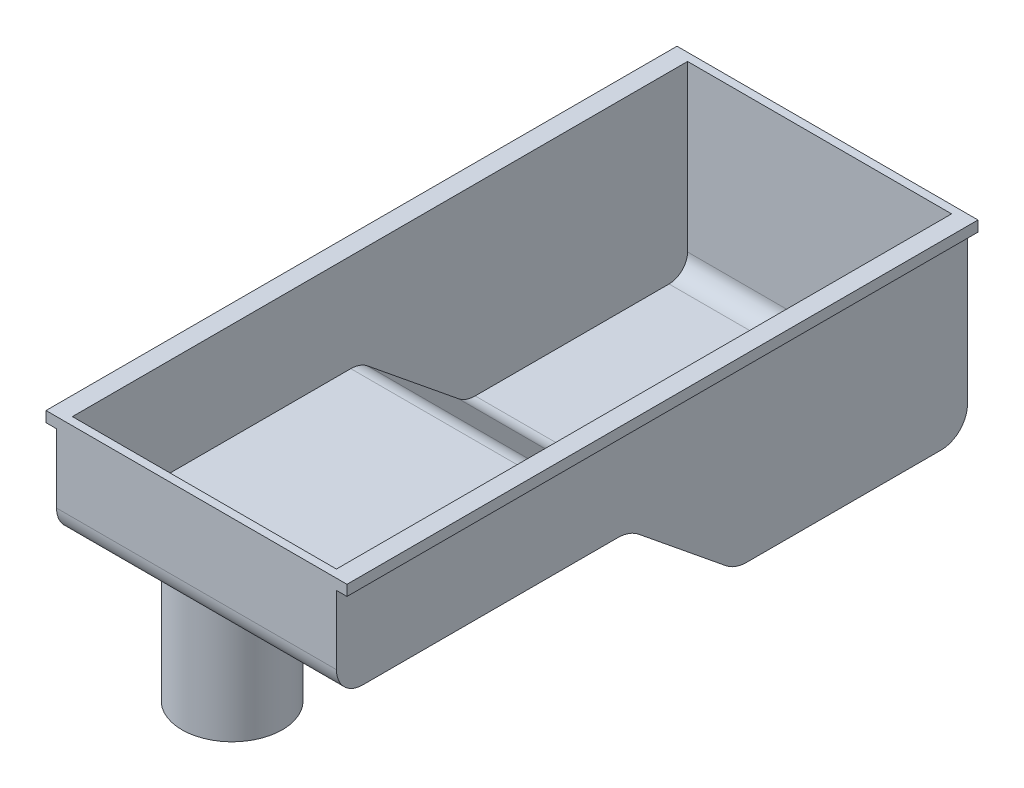
ISO-10303-21;
HEADER;
FILE_DESCRIPTION(('STEP AP214'),'2;1');
FILE_NAME('part.step','',(''),(''),'','','');
FILE_SCHEMA(('AUTOMOTIVE_DESIGN { 1 0 10303 214 1 1 1 1 }'));
ENDSEC;
DATA;
#1=APPLICATION_CONTEXT('core data for automotive mechanical design processes');
#2=APPLICATION_PROTOCOL_DEFINITION('international standard','automotive_design',2000,#1);
#3=PRODUCT_CONTEXT('',#1,'mechanical');
#4=PRODUCT('Part','Part','',(#3));
#5=PRODUCT_RELATED_PRODUCT_CATEGORY('part','',(#4));
#6=PRODUCT_DEFINITION_FORMATION('','',#4);
#7=PRODUCT_DEFINITION_CONTEXT('part definition',#1,'design');
#8=PRODUCT_DEFINITION('design','',#6,#7);
#9=PRODUCT_DEFINITION_SHAPE('','',#8);
#10=(LENGTH_UNIT() NAMED_UNIT(*) SI_UNIT(.MILLI.,.METRE.));
#11=(NAMED_UNIT(*) PLANE_ANGLE_UNIT() SI_UNIT($,.RADIAN.));
#12=(NAMED_UNIT(*) SI_UNIT($,.STERADIAN.) SOLID_ANGLE_UNIT());
#13=UNCERTAINTY_MEASURE_WITH_UNIT(LENGTH_MEASURE(1.E-05),#10,'distance_accuracy_value','');
#14=(GEOMETRIC_REPRESENTATION_CONTEXT(3) GLOBAL_UNCERTAINTY_ASSIGNED_CONTEXT((#13)) GLOBAL_UNIT_ASSIGNED_CONTEXT((#10,
#11,#12)) REPRESENTATION_CONTEXT('',''));
#15=CARTESIAN_POINT('',(0.,0.,0.));
#16=DIRECTION('',(0.,0.,1.));
#17=DIRECTION('',(1.,0.,0.));
#18=AXIS2_PLACEMENT_3D('',#15,#16,#17);
#19=CARTESIAN_POINT('',(106.,-195.,-386.));
#20=DIRECTION('',(-1.,0.,0.));
#21=DIRECTION('',(0.,0.,1.));
#22=AXIS2_PLACEMENT_3D('',#19,#20,#21);
#23=CYLINDRICAL_SURFACE('',#22,20.);
#24=CARTESIAN_POINT('',(-9.21954445729288,-215.,-386.));
#25=CARTESIAN_POINT('',(-9.05278508268081,-215.000020802602,-386.256313627976));
#26=CARTESIAN_POINT('',(-8.87530801415313,-214.995073200367,-386.505577913972));
#27=CARTESIAN_POINT('',(-8.50047353801595,-214.977024675888,-386.988206420821));
#28=CARTESIAN_POINT('',(-8.30312472437645,-214.96392726562,-387.221577442487));
#29=CARTESIAN_POINT('',(-7.89028092512723,-214.931385206945,-387.670488010725));
#30=CARTESIAN_POINT('',(-7.67481500139358,-214.911950585242,-387.886055055774));
#31=CARTESIAN_POINT('',(-7.22698577482958,-214.868577327427,-388.298392220045));
#32=CARTESIAN_POINT('',(-6.99462089651734,-214.844638271038,-388.495160582708));
#33=CARTESIAN_POINT('',(-6.51481956521724,-214.794126433541,-388.86845132525));
#34=CARTESIAN_POINT('',(-6.26739865290406,-214.767556350955,-389.044994056733));
#35=CARTESIAN_POINT('',(-5.75886897813163,-214.713557277438,-389.376973451292));
#36=CARTESIAN_POINT('',(-5.49776010593598,-214.686128279623,-389.532409945124));
#37=CARTESIAN_POINT('',(-4.96346834142791,-214.632114786935,-389.821212438654));
#38=CARTESIAN_POINT('',(-4.69028350966651,-214.605530428902,-389.95457487673));
#39=CARTESIAN_POINT('',(-4.13361887388644,-214.554787204402,-390.198309450967));
#40=CARTESIAN_POINT('',(-3.85013894391908,-214.530628367623,-390.308681305753));
#41=CARTESIAN_POINT('',(-3.26868294734252,-214.485664841521,-390.507716447418));
#42=CARTESIAN_POINT('',(-2.97052742981667,-214.464941322273,-390.595874704431));
#43=CARTESIAN_POINT('',(-2.36751580569059,-214.428713503509,-390.746695300511));
#44=CARTESIAN_POINT('',(-2.06265961676751,-214.413209268152,-390.809357326152));
#45=CARTESIAN_POINT('',(-1.44853920842501,-214.388343464008,-390.908641725651));
#46=CARTESIAN_POINT('',(-1.13927578682853,-214.378980797513,-390.945268752939));
#47=CARTESIAN_POINT('',(-0.518631179818974,-214.366951301381,-390.992172859298));
#48=CARTESIAN_POINT('',(-0.207250056176293,-214.364284277273,-391.002450703659));
#49=CARTESIAN_POINT('',(0.406436690420613,-214.365781554164,-390.996649317356));
#50=CARTESIAN_POINT('',(0.708750027151972,-214.369754867383,-390.981306978291));
#51=CARTESIAN_POINT('',(1.31093408221065,-214.383947399366,-390.925789499756));
#52=CARTESIAN_POINT('',(1.61080484028791,-214.39416651628,-390.885614765223));
#53=CARTESIAN_POINT('',(2.2060007428849,-214.420278086379,-390.780764607936));
#54=CARTESIAN_POINT('',(2.50132550327063,-214.436171016282,-390.716087126413));
#55=CARTESIAN_POINT('',(3.08537500161032,-214.472738492174,-390.562746898713));
#56=CARTESIAN_POINT('',(3.37409966690518,-214.493413090776,-390.474083888622));
#57=CARTESIAN_POINT('',(3.94286674122053,-214.538367230415,-390.273494346161));
#58=CARTESIAN_POINT('',(4.22291406938259,-214.56264468208,-390.161581282047));
#59=CARTESIAN_POINT('',(4.7728346398202,-214.613443205544,-389.915184024692));
#60=CARTESIAN_POINT('',(5.04270319943638,-214.6399652922,-389.780689594508));
#61=CARTESIAN_POINT('',(5.57041299576905,-214.693687092041,-389.490059343399));
#62=CARTESIAN_POINT('',(5.82825553208354,-214.720886731517,-389.333925868184));
#63=CARTESIAN_POINT('',(6.3302219092154,-214.774278174678,-389.001052351816));
#64=CARTESIAN_POINT('',(6.57435188964691,-214.800470427724,-388.824321643565));
#65=CARTESIAN_POINT('',(7.0450681277452,-214.849853410485,-388.453161037628));
#66=CARTESIAN_POINT('',(7.27180688867342,-214.873071825938,-388.258928293407));
#67=CARTESIAN_POINT('',(7.70894821996101,-214.915072760865,-387.852464457483));
#68=CARTESIAN_POINT('',(7.9193523867452,-214.933855714197,-387.640235128889));
#69=CARTESIAN_POINT('',(8.3226874588647,-214.965267542744,-387.198772305427));
#70=CARTESIAN_POINT('',(8.51559312998613,-214.977887642007,-386.969515094467));
#71=CARTESIAN_POINT('',(8.88228574193664,-214.995265221027,-386.495766594298));
#72=CARTESIAN_POINT('',(9.05606467296773,-215.000019418348,-386.251268989423));
#73=CARTESIAN_POINT('',(9.2195444572929,-215.,-386.));
#74=B_SPLINE_CURVE_WITH_KNOTS('',3,(#24,#25,#26,#27,#28,#29,#30,#31,#32,#33,#34,#35,#36,#37,#38,
#39,#40,#41,#42,#43,#44,#45,#46,#47,#48,#49,#50,#51,#52,#53,#54,#55,#56,#57,#58,#59,#60,#61,#62,
#63,#64,#65,#66,#67,#68,#69,#70,#71,#72,#73),.UNSPECIFIED.,.F.,.F.,(4,2,2,2,2,2,2,2,2,2,2,2,2,2,
2,2,2,2,2,2,2,2,2,2,4),(0.,0.916961714728091,1.83352855878945,2.74865219555347,3.66386125852173,
4.57814117006574,5.49242841251498,6.40686303059156,7.32130883949561,8.25497453013639,
9.18865169798879,10.1221619406943,11.0556450700144,11.9627389547508,12.8698180480442,
13.7769733728011,14.6841386794406,15.590779942727,16.497833334271,17.4047884764588,
18.311334250469,19.2087084273529,20.1059947906924,21.0045551975687,21.9034904785961),.UNSPECIFIED.);
#75=CARTESIAN_POINT('',(-9.21954445729288,-215.,-386.));
#76=VERTEX_POINT('',#75);
#77=CARTESIAN_POINT('',(9.21954445729288,-215.,-386.));
#78=VERTEX_POINT('',#77);
#79=EDGE_CURVE('E52',#76,#78,#74,.T.);
#80=ORIENTED_EDGE('',*,*,#79,.F.);
#81=DIRECTION('',(-1.,0.,0.));
#82=VECTOR('',#81,1.);
#83=CARTESIAN_POINT('',(106.,-215.,-386.));
#84=LINE('',#83,#82);
#85=CARTESIAN_POINT('',(-106.,-215.,-386.));
#86=VERTEX_POINT('',#85);
#87=EDGE_CURVE('E216',#76,#86,#84,.T.);
#88=ORIENTED_EDGE('',*,*,#87,.T.);
#89=CARTESIAN_POINT('',(-106.,-195.,-386.));
#90=DIRECTION('',(1.,0.,0.));
#91=DIRECTION('',(0.,0.,1.));
#92=AXIS2_PLACEMENT_3D('',#89,#90,#91);
#93=CIRCLE('',#92,20.);
#94=CARTESIAN_POINT('',(-106.,-195.,-406.));
#95=VERTEX_POINT('',#94);
#96=EDGE_CURVE('E551',#86,#95,#93,.T.);
#97=ORIENTED_EDGE('',*,*,#96,.T.);
#98=DIRECTION('',(-1.,0.,0.));
#99=VECTOR('',#98,1.);
#100=CARTESIAN_POINT('',(106.,-195.,-406.));
#101=LINE('',#100,#99);
#102=CARTESIAN_POINT('',(106.,-195.,-406.));
#103=VERTEX_POINT('',#102);
#104=EDGE_CURVE('E559',#103,#95,#101,.T.);
#105=ORIENTED_EDGE('',*,*,#104,.F.);
#106=CARTESIAN_POINT('',(106.,-195.,-386.));
#107=DIRECTION('',(1.,0.,0.));
#108=DIRECTION('',(0.,0.,1.));
#109=AXIS2_PLACEMENT_3D('',#106,#107,#108);
#110=CIRCLE('',#109,20.);
#111=CARTESIAN_POINT('',(106.,-215.,-386.));
#112=VERTEX_POINT('',#111);
#113=EDGE_CURVE('E215',#112,#103,#110,.T.);
#114=ORIENTED_EDGE('',*,*,#113,.F.);
#115=EDGE_CURVE('E208',#112,#78,#84,.T.);
#116=ORIENTED_EDGE('',*,*,#115,.T.);
#117=EDGE_LOOP('',(#80,#88,#97,#105,#114,#116));
#118=FACE_BOUND('',#117,.T.);
#119=ADVANCED_FACE('F44',(#118),#23,.T.);
#120=CARTESIAN_POINT('',(106.,-70.,72.));
#121=DIRECTION('',(0.,-1.,0.));
#122=DIRECTION('',(0.,0.,-1.));
#123=AXIS2_PLACEMENT_3D('',#120,#121,#122);
#124=PLANE('',#123);
#125=DIRECTION('',(-1.,0.,0.));
#126=VECTOR('',#125,1.);
#127=CARTESIAN_POINT('',(106.,-70.,-406.));
#128=LINE('',#127,#126);
#129=CARTESIAN_POINT('',(114.,-70.,-406.));
#130=VERTEX_POINT('',#129);
#131=CARTESIAN_POINT('',(-114.,-70.,-406.));
#132=VERTEX_POINT('',#131);
#133=EDGE_CURVE('E560',#130,#132,#128,.T.);
#134=ORIENTED_EDGE('',*,*,#133,.T.);
#135=DIRECTION('',(0.,0.,-1.));
#136=VECTOR('',#135,1.);
#137=CARTESIAN_POINT('',(-114.,-70.,72.));
#138=LINE('',#137,#136);
#139=CARTESIAN_POINT('',(-114.,-70.,72.));
#140=VERTEX_POINT('',#139);
#141=EDGE_CURVE('E498',#140,#132,#138,.T.);
#142=ORIENTED_EDGE('',*,*,#141,.F.);
#143=DIRECTION('',(-1.,0.,0.));
#144=VECTOR('',#143,1.);
#145=CARTESIAN_POINT('',(106.,-70.,72.));
#146=LINE('',#145,#144);
#147=CARTESIAN_POINT('',(114.,-70.,72.));
#148=VERTEX_POINT('',#147);
#149=EDGE_CURVE('E536',#148,#140,#146,.T.);
#150=ORIENTED_EDGE('',*,*,#149,.F.);
#151=DIRECTION('',(0.,0.,-1.));
#152=VECTOR('',#151,1.);
#153=CARTESIAN_POINT('',(114.,-70.,72.));
#154=LINE('',#153,#152);
#155=EDGE_CURVE('E507',#148,#130,#154,.T.);
#156=ORIENTED_EDGE('',*,*,#155,.T.);
#157=EDGE_LOOP('',(#134,#142,#150,#156));
#158=FACE_BOUND('',#157,.T.);
#159=DIRECTION('',(0.,0.,-1.));
#160=VECTOR('',#159,1.);
#161=CARTESIAN_POINT('',(100.,-70.,72.));
#162=LINE('',#161,#160);
#163=CARTESIAN_POINT('',(100.,-70.,66.));
#164=VERTEX_POINT('',#163);
#165=CARTESIAN_POINT('',(100.,-70.,-400.));
#166=VERTEX_POINT('',#165);
#167=EDGE_CURVE('E226',#164,#166,#162,.T.);
#168=ORIENTED_EDGE('',*,*,#167,.F.);
#169=DIRECTION('',(1.,0.,0.));
#170=VECTOR('',#169,1.);
#171=CARTESIAN_POINT('',(106.,-70.,66.));
#172=LINE('',#171,#170);
#173=CARTESIAN_POINT('',(-100.,-70.,66.));
#174=VERTEX_POINT('',#173);
#175=EDGE_CURVE('E230',#174,#164,#172,.T.);
#176=ORIENTED_EDGE('',*,*,#175,.F.);
#177=DIRECTION('',(0.,0.,-1.));
#178=VECTOR('',#177,1.);
#179=CARTESIAN_POINT('',(-100.,-70.,72.));
#180=LINE('',#179,#178);
#181=CARTESIAN_POINT('',(-100.,-70.,-400.));
#182=VERTEX_POINT('',#181);
#183=EDGE_CURVE('E584',#174,#182,#180,.T.);
#184=ORIENTED_EDGE('',*,*,#183,.T.);
#185=DIRECTION('',(-1.,0.,0.));
#186=VECTOR('',#185,1.);
#187=CARTESIAN_POINT('',(106.,-70.,-400.));
#188=LINE('',#187,#186);
#189=EDGE_CURVE('E583',#166,#182,#188,.T.);
#190=ORIENTED_EDGE('',*,*,#189,.F.);
#191=EDGE_LOOP('',(#168,#176,#184,#190));
#192=FACE_BOUND('',#191,.T.);
#193=ADVANCED_FACE('F307',(#158,#192),#124,.F.);
#194=CARTESIAN_POINT('',(106.,-195.,-386.));
#195=DIRECTION('',(-1.,0.,0.));
#196=DIRECTION('',(0.,0.,1.));
#197=AXIS2_PLACEMENT_3D('',#194,#195,#196);
#198=PLANE('',#197);
#199=DIRECTION('',(0.,0.,-1.));
#200=VECTOR('',#199,1.);
#201=CARTESIAN_POINT('',(106.,-78.,-386.));
#202=LINE('',#201,#200);
#203=CARTESIAN_POINT('',(106.,-78.,72.));
#204=VERTEX_POINT('',#203);
#205=CARTESIAN_POINT('',(106.,-78.,-406.));
#206=VERTEX_POINT('',#205);
#207=EDGE_CURVE('E519',#204,#206,#202,.T.);
#208=ORIENTED_EDGE('',*,*,#207,.F.);
#209=DIRECTION('',(0.,-1.,0.));
#210=VECTOR('',#209,1.);
#211=CARTESIAN_POINT('',(106.,-130.,72.));
#212=LINE('',#211,#210);
#213=CARTESIAN_POINT('',(106.,-130.,72.));
#214=VERTEX_POINT('',#213);
#215=EDGE_CURVE('E524',#204,#214,#212,.T.);
#216=ORIENTED_EDGE('',*,*,#215,.T.);
#217=CARTESIAN_POINT('',(106.,-130.,52.));
#218=DIRECTION('',(1.,0.,0.));
#219=DIRECTION('',(0.,0.,1.));
#220=AXIS2_PLACEMENT_3D('',#217,#218,#219);
#221=CIRCLE('',#220,20.);
#222=CARTESIAN_POINT('',(106.,-150.,52.));
#223=VERTEX_POINT('',#222);
#224=EDGE_CURVE('E525',#214,#223,#221,.T.);
#225=ORIENTED_EDGE('',*,*,#224,.T.);
#226=DIRECTION('',(0.,0.,-1.));
#227=VECTOR('',#226,1.);
#228=CARTESIAN_POINT('',(106.,-150.,-141.123984369061));
#229=LINE('',#228,#227);
#230=CARTESIAN_POINT('',(106.,-150.,-141.123984369061));
#231=VERTEX_POINT('',#230);
#232=EDGE_CURVE('E526',#223,#231,#229,.T.);
#233=ORIENTED_EDGE('',*,*,#232,.T.);
#234=CARTESIAN_POINT('',(106.,-175.,-141.123984369061));
#235=DIRECTION('',(-1.,0.,0.));
#236=DIRECTION('',(0.,0.,-1.));
#237=AXIS2_PLACEMENT_3D('',#234,#235,#236);
#238=CIRCLE('',#237,25.);
#239=CARTESIAN_POINT('',(106.,-155.597149997093,-156.888799996423));
#240=VERTEX_POINT('',#239);
#241=EDGE_CURVE('E528',#231,#240,#238,.T.);
#242=ORIENTED_EDGE('',*,*,#241,.T.);
#243=DIRECTION('',(0.,-0.630592625094466,-0.776114000116266));
#244=VECTOR('',#243,1.);
#245=CARTESIAN_POINT('',(106.,-209.402850002907,-223.111200003577));
#246=LINE('',#245,#244);
#247=CARTESIAN_POINT('',(106.,-209.402850002907,-223.111200003577));
#248=VERTEX_POINT('',#247);
#249=EDGE_CURVE('E529',#240,#248,#246,.T.);
#250=ORIENTED_EDGE('',*,*,#249,.T.);
#251=CARTESIAN_POINT('',(106.,-190.,-238.876015630939));
#252=DIRECTION('',(1.,0.,0.));
#253=DIRECTION('',(0.,0.,1.));
#254=AXIS2_PLACEMENT_3D('',#251,#252,#253);
#255=CIRCLE('',#254,25.);
#256=CARTESIAN_POINT('',(106.,-215.,-238.876015630939));
#257=VERTEX_POINT('',#256);
#258=EDGE_CURVE('E535',#248,#257,#255,.T.);
#259=ORIENTED_EDGE('',*,*,#258,.T.);
#260=DIRECTION('',(0.,0.,-1.));
#261=VECTOR('',#260,1.);
#262=CARTESIAN_POINT('',(106.,-215.,-386.));
#263=LINE('',#262,#261);
#264=EDGE_CURVE('E534',#257,#112,#263,.T.);
#265=ORIENTED_EDGE('',*,*,#264,.T.);
#266=ORIENTED_EDGE('',*,*,#113,.T.);
#267=DIRECTION('',(0.,1.,0.));
#268=VECTOR('',#267,1.);
#269=CARTESIAN_POINT('',(106.,-70.,-406.));
#270=LINE('',#269,#268);
#271=EDGE_CURVE('E539',#103,#206,#270,.T.);
#272=ORIENTED_EDGE('',*,*,#271,.T.);
#273=EDGE_LOOP('',(#208,#216,#225,#233,#242,#250,#259,#265,#266,#272));
#274=FACE_BOUND('',#273,.T.);
#275=ADVANCED_FACE('F304',(#274),#198,.F.);
#276=CARTESIAN_POINT('',(-106.,-195.,-386.));
#277=DIRECTION('',(-1.,0.,0.));
#278=DIRECTION('',(0.,0.,1.));
#279=AXIS2_PLACEMENT_3D('',#276,#277,#278);
#280=PLANE('',#279);
#281=DIRECTION('',(0.,-1.,0.));
#282=VECTOR('',#281,1.);
#283=CARTESIAN_POINT('',(-106.,-130.,72.));
#284=LINE('',#283,#282);
#285=CARTESIAN_POINT('',(-106.,-78.,72.));
#286=VERTEX_POINT('',#285);
#287=CARTESIAN_POINT('',(-106.,-130.,72.));
#288=VERTEX_POINT('',#287);
#289=EDGE_CURVE('E518',#286,#288,#284,.T.);
#290=ORIENTED_EDGE('',*,*,#289,.F.);
#291=DIRECTION('',(0.,0.,-1.));
#292=VECTOR('',#291,1.);
#293=CARTESIAN_POINT('',(-106.,-78.,-386.));
#294=LINE('',#293,#292);
#295=CARTESIAN_POINT('',(-106.,-78.,-406.));
#296=VERTEX_POINT('',#295);
#297=EDGE_CURVE('E576',#286,#296,#294,.T.);
#298=ORIENTED_EDGE('',*,*,#297,.T.);
#299=DIRECTION('',(0.,1.,0.));
#300=VECTOR('',#299,1.);
#301=CARTESIAN_POINT('',(-106.,-70.,-406.));
#302=LINE('',#301,#300);
#303=EDGE_CURVE('E523',#95,#296,#302,.T.);
#304=ORIENTED_EDGE('',*,*,#303,.F.);
#305=ORIENTED_EDGE('',*,*,#96,.F.);
#306=DIRECTION('',(0.,0.,-1.));
#307=VECTOR('',#306,1.);
#308=CARTESIAN_POINT('',(-106.,-215.,-386.));
#309=LINE('',#308,#307);
#310=CARTESIAN_POINT('',(-106.,-215.,-238.876015630939));
#311=VERTEX_POINT('',#310);
#312=EDGE_CURVE('E553',#311,#86,#309,.T.);
#313=ORIENTED_EDGE('',*,*,#312,.F.);
#314=CARTESIAN_POINT('',(-106.,-190.,-238.876015630939));
#315=DIRECTION('',(1.,0.,0.));
#316=DIRECTION('',(0.,0.,1.));
#317=AXIS2_PLACEMENT_3D('',#314,#315,#316);
#318=CIRCLE('',#317,25.);
#319=CARTESIAN_POINT('',(-106.,-209.402850002907,-223.111200003577));
#320=VERTEX_POINT('',#319);
#321=EDGE_CURVE('E547',#320,#311,#318,.T.);
#322=ORIENTED_EDGE('',*,*,#321,.F.);
#323=DIRECTION('',(0.,-0.630592625094466,-0.776114000116266));
#324=VECTOR('',#323,1.);
#325=CARTESIAN_POINT('',(-106.,-209.402850002907,-223.111200003577));
#326=LINE('',#325,#324);
#327=CARTESIAN_POINT('',(-106.,-155.597149997093,-156.888799996423));
#328=VERTEX_POINT('',#327);
#329=EDGE_CURVE('E550',#328,#320,#326,.T.);
#330=ORIENTED_EDGE('',*,*,#329,.F.);
#331=CARTESIAN_POINT('',(-106.,-175.,-141.123984369061));
#332=DIRECTION('',(-1.,0.,0.));
#333=DIRECTION('',(0.,0.,-1.));
#334=AXIS2_PLACEMENT_3D('',#331,#332,#333);
#335=CIRCLE('',#334,25.);
#336=CARTESIAN_POINT('',(-106.,-150.,-141.123984369061));
#337=VERTEX_POINT('',#336);
#338=EDGE_CURVE('E542',#337,#328,#335,.T.);
#339=ORIENTED_EDGE('',*,*,#338,.F.);
#340=DIRECTION('',(0.,0.,-1.));
#341=VECTOR('',#340,1.);
#342=CARTESIAN_POINT('',(-106.,-150.,-141.123984369061));
#343=LINE('',#342,#341);
#344=CARTESIAN_POINT('',(-106.,-150.,52.));
#345=VERTEX_POINT('',#344);
#346=EDGE_CURVE('E545',#345,#337,#343,.T.);
#347=ORIENTED_EDGE('',*,*,#346,.F.);
#348=CARTESIAN_POINT('',(-106.,-130.,52.));
#349=DIRECTION('',(1.,0.,0.));
#350=DIRECTION('',(0.,0.,1.));
#351=AXIS2_PLACEMENT_3D('',#348,#349,#350);
#352=CIRCLE('',#351,20.);
#353=EDGE_CURVE('E544',#288,#345,#352,.T.);
#354=ORIENTED_EDGE('',*,*,#353,.F.);
#355=EDGE_LOOP('',(#290,#298,#304,#305,#313,#322,#330,#339,#347,#354));
#356=FACE_BOUND('',#355,.T.);
#357=ADVANCED_FACE('F308',(#356),#280,.T.);
#358=CARTESIAN_POINT('',(106.,-130.,72.));
#359=DIRECTION('',(0.,0.,-1.));
#360=DIRECTION('',(-1.,0.,0.));
#361=AXIS2_PLACEMENT_3D('',#358,#359,#360);
#362=PLANE('',#361);
#363=ORIENTED_EDGE('',*,*,#149,.T.);
#364=DIRECTION('',(0.,-1.,0.));
#365=VECTOR('',#364,1.);
#366=CARTESIAN_POINT('',(-114.,-70.,72.));
#367=LINE('',#366,#365);
#368=CARTESIAN_POINT('',(-114.,-78.,72.));
#369=VERTEX_POINT('',#368);
#370=EDGE_CURVE('E487',#140,#369,#367,.T.);
#371=ORIENTED_EDGE('',*,*,#370,.T.);
#372=DIRECTION('',(1.,0.,0.));
#373=VECTOR('',#372,1.);
#374=CARTESIAN_POINT('',(-114.,-78.,72.));
#375=LINE('',#374,#373);
#376=EDGE_CURVE('E495',#369,#286,#375,.T.);
#377=ORIENTED_EDGE('',*,*,#376,.T.);
#378=ORIENTED_EDGE('',*,*,#289,.T.);
#379=DIRECTION('',(-1.,0.,0.));
#380=VECTOR('',#379,1.);
#381=CARTESIAN_POINT('',(106.,-130.,72.));
#382=LINE('',#381,#380);
#383=EDGE_CURVE('E577',#214,#288,#382,.T.);
#384=ORIENTED_EDGE('',*,*,#383,.F.);
#385=ORIENTED_EDGE('',*,*,#215,.F.);
#386=CARTESIAN_POINT('',(114.,-78.,72.));
#387=VERTEX_POINT('',#386);
#388=EDGE_CURVE('E489',#204,#387,#375,.T.);
#389=ORIENTED_EDGE('',*,*,#388,.T.);
#390=DIRECTION('',(0.,1.,0.));
#391=VECTOR('',#390,1.);
#392=CARTESIAN_POINT('',(114.,-78.,72.));
#393=LINE('',#392,#391);
#394=EDGE_CURVE('E492',#387,#148,#393,.T.);
#395=ORIENTED_EDGE('',*,*,#394,.T.);
#396=EDGE_LOOP('',(#363,#371,#377,#378,#384,#385,#389,#395));
#397=FACE_BOUND('',#396,.T.);
#398=ADVANCED_FACE('F50',(#397),#362,.F.);
#399=CARTESIAN_POINT('',(106.,-130.,52.));
#400=DIRECTION('',(-1.,0.,0.));
#401=DIRECTION('',(0.,0.,1.));
#402=AXIS2_PLACEMENT_3D('',#399,#400,#401);
#403=CYLINDRICAL_SURFACE('',#402,20.);
#404=ORIENTED_EDGE('',*,*,#353,.T.);
#405=DIRECTION('',(-1.,0.,0.));
#406=VECTOR('',#405,1.);
#407=CARTESIAN_POINT('',(106.,-150.,52.));
#408=LINE('',#407,#406);
#409=EDGE_CURVE('E572',#223,#345,#408,.T.);
#410=ORIENTED_EDGE('',*,*,#409,.F.);
#411=ORIENTED_EDGE('',*,*,#224,.F.);
#412=ORIENTED_EDGE('',*,*,#383,.T.);
#413=EDGE_LOOP('',(#404,#410,#411,#412));
#414=FACE_BOUND('',#413,.T.);
#415=ADVANCED_FACE('F360',(#414),#403,.T.);
#416=CARTESIAN_POINT('',(106.,-150.,-141.123984369061));
#417=DIRECTION('',(0.,1.,0.));
#418=DIRECTION('',(0.,0.,1.));
#419=AXIS2_PLACEMENT_3D('',#416,#417,#418);
#420=PLANE('',#419);
#421=CARTESIAN_POINT('',(-45.,-150.,0.));
#422=DIRECTION('',(0.,1.,0.));
#423=DIRECTION('',(0.,0.,1.));
#424=AXIS2_PLACEMENT_3D('',#421,#422,#423);
#425=CIRCLE('',#424,42.);
#426=CARTESIAN_POINT('',(-45.,-150.,42.));
#427=VERTEX_POINT('',#426);
#428=EDGE_CURVE('E11',#427,#427,#425,.F.);
#429=ORIENTED_EDGE('',*,*,#428,.F.);
#430=EDGE_LOOP('',(#429));
#431=FACE_BOUND('',#430,.T.);
#432=ORIENTED_EDGE('',*,*,#346,.T.);
#433=DIRECTION('',(-1.,0.,0.));
#434=VECTOR('',#433,1.);
#435=CARTESIAN_POINT('',(106.,-150.,-141.123984369061));
#436=LINE('',#435,#434);
#437=EDGE_CURVE('E569',#231,#337,#436,.T.);
#438=ORIENTED_EDGE('',*,*,#437,.F.);
#439=ORIENTED_EDGE('',*,*,#232,.F.);
#440=ORIENTED_EDGE('',*,*,#409,.T.);
#441=EDGE_LOOP('',(#432,#438,#439,#440));
#442=FACE_BOUND('',#441,.T.);
#443=ADVANCED_FACE('F352',(#431,#442),#420,.F.);
#444=CARTESIAN_POINT('',(106.,-175.,-141.123984369061));
#445=DIRECTION('',(-1.,0.,0.));
#446=DIRECTION('',(0.,0.,1.));
#447=AXIS2_PLACEMENT_3D('',#444,#445,#446);
#448=CYLINDRICAL_SURFACE('',#447,25.);
#449=ORIENTED_EDGE('',*,*,#338,.T.);
#450=DIRECTION('',(-1.,0.,0.));
#451=VECTOR('',#450,1.);
#452=CARTESIAN_POINT('',(106.,-155.597149997093,-156.888799996423));
#453=LINE('',#452,#451);
#454=EDGE_CURVE('E570',#240,#328,#453,.T.);
#455=ORIENTED_EDGE('',*,*,#454,.F.);
#456=ORIENTED_EDGE('',*,*,#241,.F.);
#457=ORIENTED_EDGE('',*,*,#437,.T.);
#458=EDGE_LOOP('',(#449,#455,#456,#457));
#459=FACE_BOUND('',#458,.T.);
#460=ADVANCED_FACE('F356',(#459),#448,.F.);
#461=CARTESIAN_POINT('',(106.,-209.402850002907,-223.111200003577));
#462=DIRECTION('',(0.,0.776114000116266,-0.630592625094466));
#463=DIRECTION('',(0.,0.630592625094466,0.776114000116266));
#464=AXIS2_PLACEMENT_3D('',#461,#462,#463);
#465=PLANE('',#464);
#466=ORIENTED_EDGE('',*,*,#329,.T.);
#467=DIRECTION('',(-1.,0.,0.));
#468=VECTOR('',#467,1.);
#469=CARTESIAN_POINT('',(106.,-209.402850002907,-223.111200003577));
#470=LINE('',#469,#468);
#471=EDGE_CURVE('E562',#248,#320,#470,.T.);
#472=ORIENTED_EDGE('',*,*,#471,.F.);
#473=ORIENTED_EDGE('',*,*,#249,.F.);
#474=ORIENTED_EDGE('',*,*,#454,.T.);
#475=EDGE_LOOP('',(#466,#472,#473,#474));
#476=FACE_BOUND('',#475,.T.);
#477=ADVANCED_FACE('F631',(#476),#465,.F.);
#478=CARTESIAN_POINT('',(106.,-190.,-238.876015630939));
#479=DIRECTION('',(-1.,0.,0.));
#480=DIRECTION('',(0.,0.,1.));
#481=AXIS2_PLACEMENT_3D('',#478,#479,#480);
#482=CYLINDRICAL_SURFACE('',#481,25.);
#483=ORIENTED_EDGE('',*,*,#321,.T.);
#484=DIRECTION('',(-1.,0.,0.));
#485=VECTOR('',#484,1.);
#486=CARTESIAN_POINT('',(106.,-215.,-238.876015630939));
#487=LINE('',#486,#485);
#488=EDGE_CURVE('E219',#257,#311,#487,.T.);
#489=ORIENTED_EDGE('',*,*,#488,.F.);
#490=ORIENTED_EDGE('',*,*,#258,.F.);
#491=ORIENTED_EDGE('',*,*,#471,.T.);
#492=EDGE_LOOP('',(#483,#489,#490,#491));
#493=FACE_BOUND('',#492,.T.);
#494=ADVANCED_FACE('F324',(#493),#482,.T.);
#495=CARTESIAN_POINT('',(106.,-215.,-386.));
#496=DIRECTION('',(0.,1.,0.));
#497=DIRECTION('',(0.,0.,1.));
#498=AXIS2_PLACEMENT_3D('',#495,#496,#497);
#499=PLANE('',#498);
#500=CARTESIAN_POINT('',(0.,-215.,-380.));
#501=DIRECTION('',(0.,1.,0.));
#502=DIRECTION('',(0.,0.,1.));
#503=AXIS2_PLACEMENT_3D('',#500,#501,#502);
#504=CIRCLE('',#503,11.);
#505=EDGE_CURVE('E217',#78,#76,#504,.F.);
#506=ORIENTED_EDGE('',*,*,#505,.F.);
#507=ORIENTED_EDGE('',*,*,#115,.F.);
#508=ORIENTED_EDGE('',*,*,#264,.F.);
#509=ORIENTED_EDGE('',*,*,#488,.T.);
#510=ORIENTED_EDGE('',*,*,#312,.T.);
#511=ORIENTED_EDGE('',*,*,#87,.F.);
#512=EDGE_LOOP('',(#506,#507,#508,#509,#510,#511));
#513=FACE_BOUND('',#512,.T.);
#514=ADVANCED_FACE('F221',(#513),#499,.F.);
#515=CARTESIAN_POINT('',(106.,-70.,-406.));
#516=DIRECTION('',(0.,0.,1.));
#517=DIRECTION('',(1.,0.,0.));
#518=AXIS2_PLACEMENT_3D('',#515,#516,#517);
#519=PLANE('',#518);
#520=ORIENTED_EDGE('',*,*,#303,.T.);
#521=DIRECTION('',(1.,0.,0.));
#522=VECTOR('',#521,1.);
#523=CARTESIAN_POINT('',(-114.,-78.,-406.));
#524=LINE('',#523,#522);
#525=CARTESIAN_POINT('',(-114.,-78.,-406.));
#526=VERTEX_POINT('',#525);
#527=EDGE_CURVE('E505',#526,#296,#524,.T.);
#528=ORIENTED_EDGE('',*,*,#527,.F.);
#529=DIRECTION('',(0.,-1.,0.));
#530=VECTOR('',#529,1.);
#531=CARTESIAN_POINT('',(-114.,-70.,-406.));
#532=LINE('',#531,#530);
#533=EDGE_CURVE('E488',#132,#526,#532,.T.);
#534=ORIENTED_EDGE('',*,*,#533,.F.);
#535=ORIENTED_EDGE('',*,*,#133,.F.);
#536=DIRECTION('',(0.,1.,0.));
#537=VECTOR('',#536,1.);
#538=CARTESIAN_POINT('',(114.,-78.,-406.));
#539=LINE('',#538,#537);
#540=CARTESIAN_POINT('',(114.,-78.,-406.));
#541=VERTEX_POINT('',#540);
#542=EDGE_CURVE('E493',#541,#130,#539,.T.);
#543=ORIENTED_EDGE('',*,*,#542,.F.);
#544=EDGE_CURVE('E501',#206,#541,#524,.T.);
#545=ORIENTED_EDGE('',*,*,#544,.F.);
#546=ORIENTED_EDGE('',*,*,#271,.F.);
#547=ORIENTED_EDGE('',*,*,#104,.T.);
#548=EDGE_LOOP('',(#520,#528,#534,#535,#543,#545,#546,#547));
#549=FACE_BOUND('',#548,.T.);
#550=ADVANCED_FACE('F303',(#549),#519,.F.);
#551=CARTESIAN_POINT('',(-114.,-70.,72.));
#552=DIRECTION('',(1.,0.,0.));
#553=DIRECTION('',(0.,0.,-1.));
#554=AXIS2_PLACEMENT_3D('',#551,#552,#553);
#555=PLANE('',#554);
#556=ORIENTED_EDGE('',*,*,#533,.T.);
#557=DIRECTION('',(0.,0.,-1.));
#558=VECTOR('',#557,1.);
#559=CARTESIAN_POINT('',(-114.,-78.,72.));
#560=LINE('',#559,#558);
#561=EDGE_CURVE('E511',#369,#526,#560,.T.);
#562=ORIENTED_EDGE('',*,*,#561,.F.);
#563=ORIENTED_EDGE('',*,*,#370,.F.);
#564=ORIENTED_EDGE('',*,*,#141,.T.);
#565=EDGE_LOOP('',(#556,#562,#563,#564));
#566=FACE_BOUND('',#565,.T.);
#567=ADVANCED_FACE('F299',(#566),#555,.F.);
#568=CARTESIAN_POINT('',(-114.,-78.,72.));
#569=DIRECTION('',(0.,1.,0.));
#570=DIRECTION('',(0.,0.,1.));
#571=AXIS2_PLACEMENT_3D('',#568,#569,#570);
#572=PLANE('',#571);
#573=ORIENTED_EDGE('',*,*,#297,.F.);
#574=ORIENTED_EDGE('',*,*,#376,.F.);
#575=ORIENTED_EDGE('',*,*,#561,.T.);
#576=ORIENTED_EDGE('',*,*,#527,.T.);
#577=EDGE_LOOP('',(#573,#574,#575,#576));
#578=FACE_BOUND('',#577,.T.);
#579=ADVANCED_FACE('F298',(#578),#572,.F.);
#580=ORIENTED_EDGE('',*,*,#388,.F.);
#581=ORIENTED_EDGE('',*,*,#207,.T.);
#582=ORIENTED_EDGE('',*,*,#544,.T.);
#583=DIRECTION('',(0.,0.,-1.));
#584=VECTOR('',#583,1.);
#585=CARTESIAN_POINT('',(114.,-78.,72.));
#586=LINE('',#585,#584);
#587=EDGE_CURVE('E512',#387,#541,#586,.T.);
#588=ORIENTED_EDGE('',*,*,#587,.F.);
#589=EDGE_LOOP('',(#580,#581,#582,#588));
#590=FACE_BOUND('',#589,.T.);
#591=ADVANCED_FACE('F295',(#590),#572,.F.);
#592=CARTESIAN_POINT('',(114.,-78.,72.));
#593=DIRECTION('',(-1.,0.,0.));
#594=DIRECTION('',(0.,0.,1.));
#595=AXIS2_PLACEMENT_3D('',#592,#593,#594);
#596=PLANE('',#595);
#597=ORIENTED_EDGE('',*,*,#542,.T.);
#598=ORIENTED_EDGE('',*,*,#155,.F.);
#599=ORIENTED_EDGE('',*,*,#394,.F.);
#600=ORIENTED_EDGE('',*,*,#587,.T.);
#601=EDGE_LOOP('',(#597,#598,#599,#600));
#602=FACE_BOUND('',#601,.T.);
#603=ADVANCED_FACE('F289',(#602),#596,.F.);
#604=CARTESIAN_POINT('',(100.,-130.,66.));
#605=DIRECTION('',(0.,0.,-1.));
#606=DIRECTION('',(-1.,0.,0.));
#607=AXIS2_PLACEMENT_3D('',#604,#605,#606);
#608=PLANE('',#607);
#609=ORIENTED_EDGE('',*,*,#175,.T.);
#610=DIRECTION('',(0.,-1.,0.));
#611=VECTOR('',#610,1.);
#612=CARTESIAN_POINT('',(100.,-130.,66.));
#613=LINE('',#612,#611);
#614=CARTESIAN_POINT('',(100.,-130.,66.));
#615=VERTEX_POINT('',#614);
#616=EDGE_CURVE('E430',#164,#615,#613,.T.);
#617=ORIENTED_EDGE('',*,*,#616,.T.);
#618=DIRECTION('',(-1.,0.,0.));
#619=VECTOR('',#618,1.);
#620=CARTESIAN_POINT('',(100.,-130.,66.));
#621=LINE('',#620,#619);
#622=CARTESIAN_POINT('',(-100.,-130.,66.));
#623=VERTEX_POINT('',#622);
#624=EDGE_CURVE('E483',#615,#623,#621,.T.);
#625=ORIENTED_EDGE('',*,*,#624,.T.);
#626=DIRECTION('',(0.,-1.,0.));
#627=VECTOR('',#626,1.);
#628=CARTESIAN_POINT('',(-100.,-130.,66.));
#629=LINE('',#628,#627);
#630=EDGE_CURVE('E222',#174,#623,#629,.T.);
#631=ORIENTED_EDGE('',*,*,#630,.F.);
#632=EDGE_LOOP('',(#609,#617,#625,#631));
#633=FACE_BOUND('',#632,.T.);
#634=ADVANCED_FACE('F258',(#633),#608,.T.);
#635=CARTESIAN_POINT('',(100.,-60.,-400.));
#636=DIRECTION('',(0.,0.,1.));
#637=DIRECTION('',(1.,0.,0.));
#638=AXIS2_PLACEMENT_3D('',#635,#636,#637);
#639=PLANE('',#638);
#640=ORIENTED_EDGE('',*,*,#189,.T.);
#641=DIRECTION('',(0.,1.,0.));
#642=VECTOR('',#641,1.);
#643=CARTESIAN_POINT('',(-100.,-60.,-400.));
#644=LINE('',#643,#642);
#645=CARTESIAN_POINT('',(-100.,-195.,-400.));
#646=VERTEX_POINT('',#645);
#647=EDGE_CURVE('E66',#646,#182,#644,.T.);
#648=ORIENTED_EDGE('',*,*,#647,.F.);
#649=DIRECTION('',(-1.,0.,0.));
#650=VECTOR('',#649,1.);
#651=CARTESIAN_POINT('',(100.,-195.,-400.));
#652=LINE('',#651,#650);
#653=CARTESIAN_POINT('',(100.,-195.,-400.));
#654=VERTEX_POINT('',#653);
#655=EDGE_CURVE('E447',#654,#646,#652,.T.);
#656=ORIENTED_EDGE('',*,*,#655,.F.);
#657=DIRECTION('',(0.,1.,0.));
#658=VECTOR('',#657,1.);
#659=CARTESIAN_POINT('',(100.,-60.,-400.));
#660=LINE('',#659,#658);
#661=EDGE_CURVE('E442',#654,#166,#660,.T.);
#662=ORIENTED_EDGE('',*,*,#661,.T.);
#663=EDGE_LOOP('',(#640,#648,#656,#662));
#664=FACE_BOUND('',#663,.T.);
#665=ADVANCED_FACE('F254',(#664),#639,.T.);
#666=CARTESIAN_POINT('',(100.,-195.,-386.));
#667=DIRECTION('',(-1.,0.,0.));
#668=DIRECTION('',(0.,0.,1.));
#669=AXIS2_PLACEMENT_3D('',#666,#667,#668);
#670=PLANE('',#669);
#671=ORIENTED_EDGE('',*,*,#167,.T.);
#672=ORIENTED_EDGE('',*,*,#661,.F.);
#673=CARTESIAN_POINT('',(100.,-195.,-386.));
#674=DIRECTION('',(1.,0.,0.));
#675=DIRECTION('',(0.,0.,1.));
#676=AXIS2_PLACEMENT_3D('',#673,#674,#675);
#677=CIRCLE('',#676,14.);
#678=CARTESIAN_POINT('',(100.,-209.,-386.));
#679=VERTEX_POINT('',#678);
#680=EDGE_CURVE('E441',#679,#654,#677,.T.);
#681=ORIENTED_EDGE('',*,*,#680,.F.);
#682=DIRECTION('',(0.,0.,-1.));
#683=VECTOR('',#682,1.);
#684=CARTESIAN_POINT('',(100.,-209.,-386.));
#685=LINE('',#684,#683);
#686=CARTESIAN_POINT('',(100.,-209.,-239.100812504751));
#687=VERTEX_POINT('',#686);
#688=EDGE_CURVE('E437',#687,#679,#685,.T.);
#689=ORIENTED_EDGE('',*,*,#688,.F.);
#690=CARTESIAN_POINT('',(100.,-189.,-239.100812504751));
#691=DIRECTION('',(1.,0.,0.));
#692=DIRECTION('',(0.,0.,1.));
#693=AXIS2_PLACEMENT_3D('',#690,#691,#692);
#694=CIRCLE('',#693,20.);
#695=CARTESIAN_POINT('',(100.,-204.522280002325,-226.488960002862));
#696=VERTEX_POINT('',#695);
#697=EDGE_CURVE('E440',#696,#687,#694,.T.);
#698=ORIENTED_EDGE('',*,*,#697,.F.);
#699=DIRECTION('',(0.,-0.630592625094466,-0.776114000116266));
#700=VECTOR('',#699,1.);
#701=CARTESIAN_POINT('',(100.,-204.522280002325,-226.488960002862));
#702=LINE('',#701,#700);
#703=CARTESIAN_POINT('',(100.,-148.477719997675,-157.511039997138));
#704=VERTEX_POINT('',#703);
#705=EDGE_CURVE('E434',#704,#696,#702,.T.);
#706=ORIENTED_EDGE('',*,*,#705,.F.);
#707=CARTESIAN_POINT('',(100.,-164.,-144.899187495249));
#708=DIRECTION('',(-1.,0.,0.));
#709=DIRECTION('',(0.,0.,-1.));
#710=AXIS2_PLACEMENT_3D('',#707,#708,#709);
#711=CIRCLE('',#710,20.);
#712=CARTESIAN_POINT('',(100.,-144.,-144.899187495249));
#713=VERTEX_POINT('',#712);
#714=EDGE_CURVE('E433',#713,#704,#711,.T.);
#715=ORIENTED_EDGE('',*,*,#714,.F.);
#716=DIRECTION('',(0.,0.,-1.));
#717=VECTOR('',#716,1.);
#718=CARTESIAN_POINT('',(100.,-144.,-144.899187495249));
#719=LINE('',#718,#717);
#720=CARTESIAN_POINT('',(100.,-144.,52.));
#721=VERTEX_POINT('',#720);
#722=EDGE_CURVE('E431',#721,#713,#719,.T.);
#723=ORIENTED_EDGE('',*,*,#722,.F.);
#724=CARTESIAN_POINT('',(100.,-130.,52.));
#725=DIRECTION('',(1.,0.,0.));
#726=DIRECTION('',(0.,0.,1.));
#727=AXIS2_PLACEMENT_3D('',#724,#725,#726);
#728=CIRCLE('',#727,14.);
#729=EDGE_CURVE('E429',#615,#721,#728,.T.);
#730=ORIENTED_EDGE('',*,*,#729,.F.);
#731=ORIENTED_EDGE('',*,*,#616,.F.);
#732=EDGE_LOOP('',(#671,#672,#681,#689,#698,#706,#715,#723,#730,#731));
#733=FACE_BOUND('',#732,.T.);
#734=ADVANCED_FACE('F248',(#733),#670,.T.);
#735=CARTESIAN_POINT('',(-100.,-195.,-386.));
#736=DIRECTION('',(-1.,0.,0.));
#737=DIRECTION('',(0.,0.,1.));
#738=AXIS2_PLACEMENT_3D('',#735,#736,#737);
#739=PLANE('',#738);
#740=ORIENTED_EDGE('',*,*,#630,.T.);
#741=CARTESIAN_POINT('',(-100.,-130.,52.));
#742=DIRECTION('',(1.,0.,0.));
#743=DIRECTION('',(0.,0.,1.));
#744=AXIS2_PLACEMENT_3D('',#741,#742,#743);
#745=CIRCLE('',#744,14.);
#746=CARTESIAN_POINT('',(-100.,-144.,52.));
#747=VERTEX_POINT('',#746);
#748=EDGE_CURVE('E449',#623,#747,#745,.T.);
#749=ORIENTED_EDGE('',*,*,#748,.T.);
#750=DIRECTION('',(0.,0.,-1.));
#751=VECTOR('',#750,1.);
#752=CARTESIAN_POINT('',(-100.,-144.,-144.899187495249));
#753=LINE('',#752,#751);
#754=CARTESIAN_POINT('',(-100.,-144.,-144.899187495249));
#755=VERTEX_POINT('',#754);
#756=EDGE_CURVE('E448',#747,#755,#753,.T.);
#757=ORIENTED_EDGE('',*,*,#756,.T.);
#758=CARTESIAN_POINT('',(-100.,-164.,-144.899187495249));
#759=DIRECTION('',(-1.,0.,0.));
#760=DIRECTION('',(0.,0.,-1.));
#761=AXIS2_PLACEMENT_3D('',#758,#759,#760);
#762=CIRCLE('',#761,20.);
#763=CARTESIAN_POINT('',(-100.,-148.477719997675,-157.511039997138));
#764=VERTEX_POINT('',#763);
#765=EDGE_CURVE('E454',#755,#764,#762,.T.);
#766=ORIENTED_EDGE('',*,*,#765,.T.);
#767=DIRECTION('',(0.,-0.630592625094466,-0.776114000116266));
#768=VECTOR('',#767,1.);
#769=CARTESIAN_POINT('',(-100.,-204.522280002325,-226.488960002862));
#770=LINE('',#769,#768);
#771=CARTESIAN_POINT('',(-100.,-204.522280002325,-226.488960002862));
#772=VERTEX_POINT('',#771);
#773=EDGE_CURVE('E451',#764,#772,#770,.T.);
#774=ORIENTED_EDGE('',*,*,#773,.T.);
#775=CARTESIAN_POINT('',(-100.,-189.,-239.100812504751));
#776=DIRECTION('',(1.,0.,0.));
#777=DIRECTION('',(0.,0.,1.));
#778=AXIS2_PLACEMENT_3D('',#775,#776,#777);
#779=CIRCLE('',#778,20.);
#780=CARTESIAN_POINT('',(-100.,-209.,-239.100812504751));
#781=VERTEX_POINT('',#780);
#782=EDGE_CURVE('E459',#772,#781,#779,.T.);
#783=ORIENTED_EDGE('',*,*,#782,.T.);
#784=DIRECTION('',(0.,0.,-1.));
#785=VECTOR('',#784,1.);
#786=CARTESIAN_POINT('',(-100.,-209.,-386.));
#787=LINE('',#786,#785);
#788=CARTESIAN_POINT('',(-100.,-209.,-386.));
#789=VERTEX_POINT('',#788);
#790=EDGE_CURVE('E460',#781,#789,#787,.T.);
#791=ORIENTED_EDGE('',*,*,#790,.T.);
#792=CARTESIAN_POINT('',(-100.,-195.,-386.));
#793=DIRECTION('',(1.,0.,0.));
#794=DIRECTION('',(0.,0.,1.));
#795=AXIS2_PLACEMENT_3D('',#792,#793,#794);
#796=CIRCLE('',#795,14.);
#797=EDGE_CURVE('E457',#789,#646,#796,.T.);
#798=ORIENTED_EDGE('',*,*,#797,.T.);
#799=ORIENTED_EDGE('',*,*,#647,.T.);
#800=ORIENTED_EDGE('',*,*,#183,.F.);
#801=EDGE_LOOP('',(#740,#749,#757,#766,#774,#783,#791,#798,#799,#800));
#802=FACE_BOUND('',#801,.T.);
#803=ADVANCED_FACE('F255',(#802),#739,.F.);
#804=CARTESIAN_POINT('',(100.,-130.,52.));
#805=DIRECTION('',(-1.,0.,0.));
#806=DIRECTION('',(0.,0.,1.));
#807=AXIS2_PLACEMENT_3D('',#804,#805,#806);
#808=CYLINDRICAL_SURFACE('',#807,14.);
#809=ORIENTED_EDGE('',*,*,#748,.F.);
#810=ORIENTED_EDGE('',*,*,#624,.F.);
#811=ORIENTED_EDGE('',*,*,#729,.T.);
#812=DIRECTION('',(-1.,0.,0.));
#813=VECTOR('',#812,1.);
#814=CARTESIAN_POINT('',(100.,-144.,52.));
#815=LINE('',#814,#813);
#816=EDGE_CURVE('E477',#721,#747,#815,.T.);
#817=ORIENTED_EDGE('',*,*,#816,.T.);
#818=EDGE_LOOP('',(#809,#810,#811,#817));
#819=FACE_BOUND('',#818,.T.);
#820=ADVANCED_FACE('F259',(#819),#808,.F.);
#821=CARTESIAN_POINT('',(100.,-144.,-144.899187495249));
#822=DIRECTION('',(0.,1.,0.));
#823=DIRECTION('',(0.,0.,1.));
#824=AXIS2_PLACEMENT_3D('',#821,#822,#823);
#825=PLANE('',#824);
#826=ORIENTED_EDGE('',*,*,#756,.F.);
#827=ORIENTED_EDGE('',*,*,#816,.F.);
#828=ORIENTED_EDGE('',*,*,#722,.T.);
#829=DIRECTION('',(-1.,0.,0.));
#830=VECTOR('',#829,1.);
#831=CARTESIAN_POINT('',(100.,-144.,-144.899187495249));
#832=LINE('',#831,#830);
#833=EDGE_CURVE('E476',#713,#755,#832,.T.);
#834=ORIENTED_EDGE('',*,*,#833,.T.);
#835=EDGE_LOOP('',(#826,#827,#828,#834));
#836=FACE_BOUND('',#835,.T.);
#837=ADVANCED_FACE('F278',(#836),#825,.T.);
#838=CARTESIAN_POINT('',(100.,-164.,-144.899187495249));
#839=DIRECTION('',(-1.,0.,0.));
#840=DIRECTION('',(0.,0.,1.));
#841=AXIS2_PLACEMENT_3D('',#838,#839,#840);
#842=CYLINDRICAL_SURFACE('',#841,20.);
#843=ORIENTED_EDGE('',*,*,#765,.F.);
#844=ORIENTED_EDGE('',*,*,#833,.F.);
#845=ORIENTED_EDGE('',*,*,#714,.T.);
#846=DIRECTION('',(-1.,0.,0.));
#847=VECTOR('',#846,1.);
#848=CARTESIAN_POINT('',(100.,-148.477719997675,-157.511039997138));
#849=LINE('',#848,#847);
#850=EDGE_CURVE('E471',#704,#764,#849,.T.);
#851=ORIENTED_EDGE('',*,*,#850,.T.);
#852=EDGE_LOOP('',(#843,#844,#845,#851));
#853=FACE_BOUND('',#852,.T.);
#854=ADVANCED_FACE('F277',(#853),#842,.T.);
#855=CARTESIAN_POINT('',(100.,-204.522280002325,-226.488960002862));
#856=DIRECTION('',(0.,0.776114000116266,-0.630592625094466));
#857=DIRECTION('',(0.,0.630592625094466,0.776114000116266));
#858=AXIS2_PLACEMENT_3D('',#855,#856,#857);
#859=PLANE('',#858);
#860=ORIENTED_EDGE('',*,*,#773,.F.);
#861=ORIENTED_EDGE('',*,*,#850,.F.);
#862=ORIENTED_EDGE('',*,*,#705,.T.);
#863=DIRECTION('',(-1.,0.,0.));
#864=VECTOR('',#863,1.);
#865=CARTESIAN_POINT('',(100.,-204.522280002325,-226.488960002862));
#866=LINE('',#865,#864);
#867=EDGE_CURVE('E472',#696,#772,#866,.T.);
#868=ORIENTED_EDGE('',*,*,#867,.T.);
#869=EDGE_LOOP('',(#860,#861,#862,#868));
#870=FACE_BOUND('',#869,.T.);
#871=ADVANCED_FACE('F275',(#870),#859,.T.);
#872=CARTESIAN_POINT('',(100.,-189.,-239.100812504751));
#873=DIRECTION('',(-1.,0.,0.));
#874=DIRECTION('',(0.,0.,1.));
#875=AXIS2_PLACEMENT_3D('',#872,#873,#874);
#876=CYLINDRICAL_SURFACE('',#875,20.);
#877=ORIENTED_EDGE('',*,*,#782,.F.);
#878=ORIENTED_EDGE('',*,*,#867,.F.);
#879=ORIENTED_EDGE('',*,*,#697,.T.);
#880=DIRECTION('',(-1.,0.,0.));
#881=VECTOR('',#880,1.);
#882=CARTESIAN_POINT('',(100.,-209.,-239.100812504751));
#883=LINE('',#882,#881);
#884=EDGE_CURVE('E466',#687,#781,#883,.T.);
#885=ORIENTED_EDGE('',*,*,#884,.T.);
#886=EDGE_LOOP('',(#877,#878,#879,#885));
#887=FACE_BOUND('',#886,.T.);
#888=ADVANCED_FACE('F268',(#887),#876,.F.);
#889=CARTESIAN_POINT('',(100.,-209.,-386.));
#890=DIRECTION('',(0.,1.,0.));
#891=DIRECTION('',(0.,0.,1.));
#892=AXIS2_PLACEMENT_3D('',#889,#890,#891);
#893=PLANE('',#892);
#894=ORIENTED_EDGE('',*,*,#790,.F.);
#895=ORIENTED_EDGE('',*,*,#884,.F.);
#896=ORIENTED_EDGE('',*,*,#688,.T.);
#897=DIRECTION('',(-1.,0.,0.));
#898=VECTOR('',#897,1.);
#899=CARTESIAN_POINT('',(100.,-209.,-386.));
#900=LINE('',#899,#898);
#901=EDGE_CURVE('E464',#679,#789,#900,.T.);
#902=ORIENTED_EDGE('',*,*,#901,.T.);
#903=EDGE_LOOP('',(#894,#895,#896,#902));
#904=FACE_BOUND('',#903,.T.);
#905=ADVANCED_FACE('F263',(#904),#893,.T.);
#906=CARTESIAN_POINT('',(100.,-195.,-386.));
#907=DIRECTION('',(-1.,0.,0.));
#908=DIRECTION('',(0.,0.,1.));
#909=AXIS2_PLACEMENT_3D('',#906,#907,#908);
#910=CYLINDRICAL_SURFACE('',#909,14.);
#911=ORIENTED_EDGE('',*,*,#797,.F.);
#912=ORIENTED_EDGE('',*,*,#901,.F.);
#913=ORIENTED_EDGE('',*,*,#680,.T.);
#914=ORIENTED_EDGE('',*,*,#655,.T.);
#915=EDGE_LOOP('',(#911,#912,#913,#914));
#916=FACE_BOUND('',#915,.T.);
#917=ADVANCED_FACE('F246',(#916),#910,.F.);
#918=CARTESIAN_POINT('',(0.,-214.,-380.));
#919=DIRECTION('',(0.,-1.,0.));
#920=DIRECTION('',(0.,0.,-1.));
#921=AXIS2_PLACEMENT_3D('',#918,#919,#920);
#922=CYLINDRICAL_SURFACE('',#921,11.);
#923=CARTESIAN_POINT('',(0.,-225.,-380.));
#924=DIRECTION('',(0.,1.,0.));
#925=DIRECTION('',(0.,0.,1.));
#926=AXIS2_PLACEMENT_3D('',#923,#924,#925);
#927=CIRCLE('',#926,11.);
#928=CARTESIAN_POINT('',(0.,-225.,-369.));
#929=VERTEX_POINT('',#928);
#930=EDGE_CURVE('E224',#929,#929,#927,.T.);
#931=ORIENTED_EDGE('',*,*,#930,.T.);
#932=EDGE_LOOP('',(#931));
#933=FACE_BOUND('',#932,.T.);
#934=ORIENTED_EDGE('',*,*,#79,.T.);
#935=ORIENTED_EDGE('',*,*,#505,.T.);
#936=EDGE_LOOP('',(#934,#935));
#937=FACE_BOUND('',#936,.T.);
#938=ADVANCED_FACE('F227',(#933,#937),#922,.T.);
#939=CARTESIAN_POINT('',(0.,-225.,-380.));
#940=DIRECTION('',(0.,1.,0.));
#941=DIRECTION('',(0.,0.,1.));
#942=AXIS2_PLACEMENT_3D('',#939,#940,#941);
#943=PLANE('',#942);
#944=ORIENTED_EDGE('',*,*,#930,.F.);
#945=EDGE_LOOP('',(#944));
#946=FACE_BOUND('',#945,.T.);
#947=ADVANCED_FACE('F244',(#946),#943,.F.);
#948=CARTESIAN_POINT('',(-45.,-149.,0.));
#949=DIRECTION('',(0.,-1.,0.));
#950=DIRECTION('',(0.,0.,-1.));
#951=AXIS2_PLACEMENT_3D('',#948,#949,#950);
#952=CYLINDRICAL_SURFACE('',#951,42.);
#953=CARTESIAN_POINT('',(-45.,-160.,0.));
#954=DIRECTION('',(0.,1.,0.));
#955=DIRECTION('',(0.,0.,1.));
#956=AXIS2_PLACEMENT_3D('',#953,#954,#955);
#957=CIRCLE('',#956,42.);
#958=CARTESIAN_POINT('',(-45.,-160.,42.));
#959=VERTEX_POINT('',#958);
#960=EDGE_CURVE('E419',#959,#959,#957,.T.);
#961=ORIENTED_EDGE('',*,*,#960,.T.);
#962=EDGE_LOOP('',(#961));
#963=FACE_BOUND('',#962,.T.);
#964=ORIENTED_EDGE('',*,*,#428,.T.);
#965=EDGE_LOOP('',(#964));
#966=FACE_BOUND('',#965,.T.);
#967=ADVANCED_FACE('F350',(#963,#966),#952,.T.);
#968=CARTESIAN_POINT('',(-45.,-160.,0.));
#969=DIRECTION('',(0.,1.,0.));
#970=DIRECTION('',(0.,0.,1.));
#971=AXIS2_PLACEMENT_3D('',#968,#969,#970);
#972=PLANE('',#971);
#973=CARTESIAN_POINT('',(-45.,-160.,0.));
#974=DIRECTION('',(0.,1.,0.));
#975=DIRECTION('',(0.,0.,1.));
#976=AXIS2_PLACEMENT_3D('',#973,#974,#975);
#977=CIRCLE('',#976,38.);
#978=CARTESIAN_POINT('',(-45.,-160.,38.));
#979=VERTEX_POINT('',#978);
#980=EDGE_CURVE('E420',#979,#979,#977,.T.);
#981=ORIENTED_EDGE('',*,*,#980,.T.);
#982=EDGE_LOOP('',(#981));
#983=FACE_BOUND('',#982,.T.);
#984=ORIENTED_EDGE('',*,*,#960,.F.);
#985=EDGE_LOOP('',(#984));
#986=FACE_BOUND('',#985,.T.);
#987=ADVANCED_FACE('F367',(#983,#986),#972,.F.);
#988=CARTESIAN_POINT('',(-45.,-160.,0.));
#989=DIRECTION('',(0.,-1.,0.));
#990=DIRECTION('',(0.,0.,-1.));
#991=AXIS2_PLACEMENT_3D('',#988,#989,#990);
#992=CYLINDRICAL_SURFACE('',#991,38.);
#993=ORIENTED_EDGE('',*,*,#980,.F.);
#994=EDGE_LOOP('',(#993));
#995=FACE_BOUND('',#994,.T.);
#996=CARTESIAN_POINT('',(-45.,-262.,0.));
#997=DIRECTION('',(0.,1.,0.));
#998=DIRECTION('',(0.,0.,1.));
#999=AXIS2_PLACEMENT_3D('',#996,#997,#998);
#1000=CIRCLE('',#999,38.);
#1001=CARTESIAN_POINT('',(-45.,-262.,38.));
#1002=VERTEX_POINT('',#1001);
#1003=EDGE_CURVE('E412',#1002,#1002,#1000,.T.);
#1004=ORIENTED_EDGE('',*,*,#1003,.T.);
#1005=EDGE_LOOP('',(#1004));
#1006=FACE_BOUND('',#1005,.T.);
#1007=ADVANCED_FACE('F380',(#995,#1006),#992,.T.);
#1008=CARTESIAN_POINT('',(-45.,-262.,0.));
#1009=DIRECTION('',(0.,1.,0.));
#1010=DIRECTION('',(0.,0.,1.));
#1011=AXIS2_PLACEMENT_3D('',#1008,#1009,#1010);
#1012=PLANE('',#1011);
#1013=ORIENTED_EDGE('',*,*,#1003,.F.);
#1014=EDGE_LOOP('',(#1013));
#1015=FACE_BOUND('',#1014,.T.);
#1016=ADVANCED_FACE('F390',(#1015),#1012,.F.);
#1017=CLOSED_SHELL('',(#119,#193,#275,#357,#398,#415,#443,#460,#477,#494,#514,#550,#567,#579,
#591,#603,#634,#665,#734,#803,#820,#837,#854,#871,#888,#905,#917,#938,#947,#967,#987,#1007,#1016));
#1018=MANIFOLD_SOLID_BREP('B2',#1017);
#1019=ADVANCED_BREP_SHAPE_REPRESENTATION('',(#18,#1018),#14);
#1020=SHAPE_DEFINITION_REPRESENTATION(#9,#1019);
ENDSEC;
END-ISO-10303-21;
